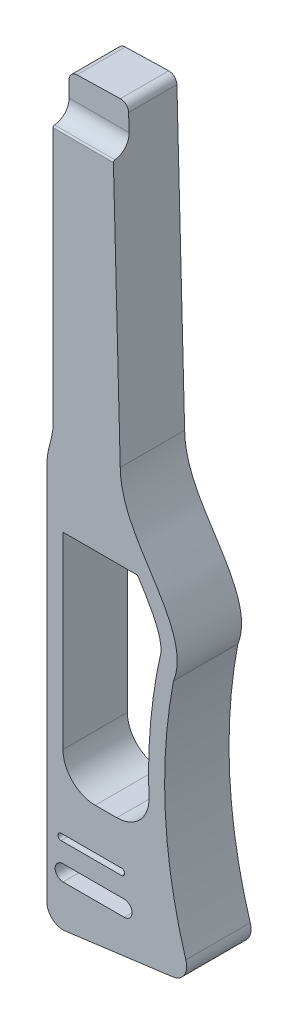
ISO-10303-21;
HEADER;
FILE_DESCRIPTION(('STEP AP214'),'2;1');
FILE_NAME('part.step','',(''),(''),'','','');
FILE_SCHEMA(('AUTOMOTIVE_DESIGN { 1 0 10303 214 1 1 1 1 }'));
ENDSEC;
DATA;
#1=APPLICATION_CONTEXT('core data for automotive mechanical design processes');
#2=APPLICATION_PROTOCOL_DEFINITION('international standard','automotive_design',2000,#1);
#3=PRODUCT_CONTEXT('',#1,'mechanical');
#4=PRODUCT('Part','Part','',(#3));
#5=PRODUCT_RELATED_PRODUCT_CATEGORY('part','',(#4));
#6=PRODUCT_DEFINITION_FORMATION('','',#4);
#7=PRODUCT_DEFINITION_CONTEXT('part definition',#1,'design');
#8=PRODUCT_DEFINITION('design','',#6,#7);
#9=PRODUCT_DEFINITION_SHAPE('','',#8);
#10=(LENGTH_UNIT() NAMED_UNIT(*) SI_UNIT(.MILLI.,.METRE.));
#11=(NAMED_UNIT(*) PLANE_ANGLE_UNIT() SI_UNIT($,.RADIAN.));
#12=(NAMED_UNIT(*) SI_UNIT($,.STERADIAN.) SOLID_ANGLE_UNIT());
#13=UNCERTAINTY_MEASURE_WITH_UNIT(LENGTH_MEASURE(1.E-05),#10,'distance_accuracy_value','');
#14=(GEOMETRIC_REPRESENTATION_CONTEXT(3) GLOBAL_UNCERTAINTY_ASSIGNED_CONTEXT((#13)) GLOBAL_UNIT_ASSIGNED_CONTEXT((#10,
#11,#12)) REPRESENTATION_CONTEXT('',''));
#15=CARTESIAN_POINT('',(0.,0.,0.));
#16=DIRECTION('',(0.,0.,1.));
#17=DIRECTION('',(1.,0.,0.));
#18=AXIS2_PLACEMENT_3D('',#15,#16,#17);
#19=CARTESIAN_POINT('',(0.,0.,40.));
#20=DIRECTION('',(0.,0.,1.));
#21=DIRECTION('',(1.,0.,0.));
#22=AXIS2_PLACEMENT_3D('',#19,#20,#21);
#23=PLANE('',#22);
#24=DIRECTION('',(0.02611191414376,-0.999659025838185,0.));
#25=VECTOR('',#24,1.);
#26=CARTESIAN_POINT('',(305.905264689105,7.99049656055332,40.));
#27=LINE('',#26,#25);
#28=CARTESIAN_POINT('',(292.8468141482,507.915468541098,40.));
#29=VERTEX_POINT('',#28);
#30=CARTESIAN_POINT('',(297.075455465632,346.027702032291,40.));
#31=VERTEX_POINT('',#30);
#32=EDGE_CURVE('E357',#29,#31,#27,.T.);
#33=ORIENTED_EDGE('',*,*,#32,.F.);
#34=DIRECTION('',(-1.,0.,0.));
#35=VECTOR('',#34,1.);
#36=CARTESIAN_POINT('',(260.321883100871,507.915468541098,40.));
#37=LINE('',#36,#35);
#38=CARTESIAN_POINT('',(255.321883100871,507.915468541098,40.));
#39=VERTEX_POINT('',#38);
#40=EDGE_CURVE('E449',#29,#39,#37,.T.);
#41=ORIENTED_EDGE('',*,*,#40,.T.);
#42=DIRECTION('',(0.,1.,0.));
#43=VECTOR('',#42,1.);
#44=CARTESIAN_POINT('',(255.321883100871,0.,40.));
#45=LINE('',#44,#43);
#46=CARTESIAN_POINT('',(255.321883100871,346.027702032291,40.));
#47=VERTEX_POINT('',#46);
#48=EDGE_CURVE('E410',#47,#39,#45,.T.);
#49=ORIENTED_EDGE('',*,*,#48,.F.);
#50=CARTESIAN_POINT('',(255.321883100871,346.027702032291,40.));
#51=CARTESIAN_POINT('',(254.757957001692,342.410351737177,40.));
#52=CARTESIAN_POINT('',(253.986764209967,338.857518857142,40.));
#53=CARTESIAN_POINT('',(253.008304725104,335.369203390077,40.));
#54=B_SPLINE_CURVE_WITH_KNOTS('',3,(#50,#51,#52,#53),.UNSPECIFIED.,.F.,.F.,(4,4),(0.,
0.135221531156),.UNSPECIFIED.);
#55=CARTESIAN_POINT('',(253.008304725104,335.369203390077,40.));
#56=VERTEX_POINT('',#55);
#57=EDGE_CURVE('E489',#47,#56,#54,.T.);
#58=ORIENTED_EDGE('',*,*,#57,.T.);
#59=CARTESIAN_POINT('',(291.521898802891,324.566283821207,40.));
#60=DIRECTION('',(0.,0.,1.));
#61=DIRECTION('',(1.,0.,0.));
#62=AXIS2_PLACEMENT_3D('',#59,#60,#61);
#63=CIRCLE('',#62,39.9999999999999);
#64=CARTESIAN_POINT('',(251.521898802891,324.566283821207,40.));
#65=VERTEX_POINT('',#64);
#66=EDGE_CURVE('E494',#65,#56,#63,.F.);
#67=ORIENTED_EDGE('',*,*,#66,.F.);
#68=DIRECTION('',(0.,-1.,0.));
#69=VECTOR('',#68,1.);
#70=CARTESIAN_POINT('',(251.521898802891,0.,40.));
#71=LINE('',#70,#69);
#72=CARTESIAN_POINT('',(251.521898802891,89.4346566660772,40.));
#73=VERTEX_POINT('',#72);
#74=EDGE_CURVE('E527',#65,#73,#71,.T.);
#75=ORIENTED_EDGE('',*,*,#74,.T.);
#76=CARTESIAN_POINT('',(261.521898802891,89.4346566660772,40.));
#77=DIRECTION('',(0.,0.,1.));
#78=DIRECTION('',(1.,0.,0.));
#79=AXIS2_PLACEMENT_3D('',#76,#77,#78);
#80=CIRCLE('',#79,10.);
#81=CARTESIAN_POINT('',(262.816280155599,79.5187816712135,40.));
#82=VERTEX_POINT('',#81);
#83=EDGE_CURVE('E528',#73,#82,#80,.T.);
#84=ORIENTED_EDGE('',*,*,#83,.T.);
#85=DIRECTION('',(0.991587499486364,0.129438135270795,0.));
#86=VECTOR('',#85,1.);
#87=CARTESIAN_POINT('',(-5.80289031391074,44.4542366446055,40.));
#88=LINE('',#87,#86);
#89=CARTESIAN_POINT('',(329.661316311539,88.2444834742471,40.));
#90=VERTEX_POINT('',#89);
#91=EDGE_CURVE('E530',#82,#90,#88,.T.);
#92=ORIENTED_EDGE('',*,*,#91,.T.);
#93=CARTESIAN_POINT('',(328.366934958831,98.1603584691108,40.));
#94=DIRECTION('',(0.,0.,1.));
#95=DIRECTION('',(1.,0.,0.));
#96=AXIS2_PLACEMENT_3D('',#93,#94,#95);
#97=CIRCLE('',#96,9.99999999999999);
#98=CARTESIAN_POINT('',(337.812674038105,101.44334693182,40.));
#99=VERTEX_POINT('',#98);
#100=EDGE_CURVE('E533',#90,#99,#97,.T.);
#101=ORIENTED_EDGE('',*,*,#100,.T.);
#102=CARTESIAN_POINT('',(628.997561791696,189.985352761071,40.));
#103=DIRECTION('',(0.,0.,1.));
#104=DIRECTION('',(1.,0.,0.));
#105=AXIS2_PLACEMENT_3D('',#102,#103,#104);
#106=CIRCLE('',#105,304.349019469981);
#107=CARTESIAN_POINT('',(330.156614349446,247.625736036663,40.));
#108=VERTEX_POINT('',#107);
#109=EDGE_CURVE('E358',#99,#108,#106,.F.);
#110=ORIENTED_EDGE('',*,*,#109,.T.);
#111=CARTESIAN_POINT('',(330.156614349446,247.625736036663,40.));
#112=CARTESIAN_POINT('',(336.006706917037,262.277420590883,40.));
#113=CARTESIAN_POINT('',(320.767736692271,296.804281945168,40.));
#114=CARTESIAN_POINT('',(297.413910682926,323.509414189747,40.));
#115=CARTESIAN_POINT('',(297.075455465632,346.027702032291,40.));
#116=B_SPLINE_CURVE_WITH_KNOTS('',3,(#111,#112,#113,#114,#115),.UNSPECIFIED.,.F.,.F.,(4,1,4),
(0.,0.411549100764503,1.),.UNSPECIFIED.);
#117=EDGE_CURVE('E350',#108,#31,#116,.T.);
#118=ORIENTED_EDGE('',*,*,#117,.T.);
#119=EDGE_LOOP('',(#33,#41,#49,#58,#67,#75,#84,#92,#101,#110,#118));
#120=FACE_BOUND('',#119,.T.);
#121=CARTESIAN_POINT('',(260.321883100871,128.869919691201,40.));
#122=DIRECTION('',(0.,0.,1.));
#123=DIRECTION('',(-1.,0.,0.));
#124=AXIS2_PLACEMENT_3D('',#121,#122,#123);
#125=CIRCLE('',#124,2.);
#126=CARTESIAN_POINT('',(260.321883100871,130.869919691201,40.));
#127=VERTEX_POINT('',#126);
#128=CARTESIAN_POINT('',(260.321883100871,126.869919691201,40.));
#129=VERTEX_POINT('',#128);
#130=EDGE_CURVE('E577',#127,#129,#125,.T.);
#131=ORIENTED_EDGE('',*,*,#130,.F.);
#132=DIRECTION('',(-1.,0.,0.));
#133=VECTOR('',#132,1.);
#134=CARTESIAN_POINT('',(260.321883100871,130.869919691201,40.));
#135=LINE('',#134,#133);
#136=CARTESIAN_POINT('',(297.821883100871,130.869919691201,40.));
#137=VERTEX_POINT('',#136);
#138=EDGE_CURVE('E567',#137,#127,#135,.T.);
#139=ORIENTED_EDGE('',*,*,#138,.F.);
#140=CARTESIAN_POINT('',(297.821883100871,128.869919691201,40.));
#141=DIRECTION('',(0.,0.,1.));
#142=DIRECTION('',(1.,0.,0.));
#143=AXIS2_PLACEMENT_3D('',#140,#141,#142);
#144=CIRCLE('',#143,2.);
#145=CARTESIAN_POINT('',(297.821883100871,126.869919691201,40.));
#146=VERTEX_POINT('',#145);
#147=EDGE_CURVE('E571',#146,#137,#144,.T.);
#148=ORIENTED_EDGE('',*,*,#147,.F.);
#149=DIRECTION('',(1.,0.,0.));
#150=VECTOR('',#149,1.);
#151=CARTESIAN_POINT('',(260.321883100871,126.869919691201,40.));
#152=LINE('',#151,#150);
#153=EDGE_CURVE('E574',#129,#146,#152,.T.);
#154=ORIENTED_EDGE('',*,*,#153,.F.);
#155=EDGE_LOOP('',(#131,#139,#148,#154));
#156=FACE_BOUND('',#155,.T.);
#157=CARTESIAN_POINT('',(299.520758284586,110.129911588462,40.));
#158=DIRECTION('',(0.,0.,1.));
#159=DIRECTION('',(1.,0.,0.));
#160=AXIS2_PLACEMENT_3D('',#157,#158,#159);
#161=CIRCLE('',#160,4.89448851457758);
#162=CARTESIAN_POINT('',(299.520758284586,105.235423073884,40.));
#163=VERTEX_POINT('',#162);
#164=CARTESIAN_POINT('',(299.520758284586,115.024400103039,40.));
#165=VERTEX_POINT('',#164);
#166=EDGE_CURVE('E616',#163,#165,#161,.T.);
#167=ORIENTED_EDGE('',*,*,#166,.F.);
#168=DIRECTION('',(1.,0.,0.));
#169=VECTOR('',#168,1.);
#170=CARTESIAN_POINT('',(0.,105.235423073884,40.));
#171=LINE('',#170,#169);
#172=CARTESIAN_POINT('',(261.521898802891,105.235423073884,40.));
#173=VERTEX_POINT('',#172);
#174=EDGE_CURVE('E603',#173,#163,#171,.T.);
#175=ORIENTED_EDGE('',*,*,#174,.F.);
#176=CARTESIAN_POINT('',(261.521898802891,110.129911588462,40.));
#177=DIRECTION('',(0.,0.,1.));
#178=DIRECTION('',(1.,0.,0.));
#179=AXIS2_PLACEMENT_3D('',#176,#177,#178);
#180=CIRCLE('',#179,4.89448851457758);
#181=CARTESIAN_POINT('',(261.521898802891,115.024400103039,40.));
#182=VERTEX_POINT('',#181);
#183=EDGE_CURVE('E599',#182,#173,#180,.T.);
#184=ORIENTED_EDGE('',*,*,#183,.F.);
#185=DIRECTION('',(1.,0.,0.));
#186=VECTOR('',#185,1.);
#187=CARTESIAN_POINT('',(0.,115.024400103039,40.));
#188=LINE('',#187,#186);
#189=EDGE_CURVE('E613',#182,#165,#188,.T.);
#190=ORIENTED_EDGE('',*,*,#189,.T.);
#191=EDGE_LOOP('',(#167,#175,#184,#190));
#192=FACE_BOUND('',#191,.T.);
#193=CARTESIAN_POINT('',(628.997561791696,189.985352761071,40.));
#194=DIRECTION('',(0.,0.,1.));
#195=DIRECTION('',(1.,0.,0.));
#196=AXIS2_PLACEMENT_3D('',#193,#194,#195);
#197=CIRCLE('',#196,314.349019469981);
#198=CARTESIAN_POINT('',(322.456329799641,259.611347407694,40.));
#199=VERTEX_POINT('',#198);
#200=CARTESIAN_POINT('',(314.904588230465,177.300322165835,40.));
#201=VERTEX_POINT('',#200);
#202=EDGE_CURVE('E249',#199,#201,#197,.T.);
#203=ORIENTED_EDGE('',*,*,#202,.T.);
#204=CARTESIAN_POINT('',(294.920878779688,176.493255510012,40.));
#205=DIRECTION('',(0.,0.,1.));
#206=DIRECTION('',(1.,0.,0.));
#207=AXIS2_PLACEMENT_3D('',#204,#205,#206);
#208=CIRCLE('',#207,20.);
#209=CARTESIAN_POINT('',(294.920878779688,156.493255510012,40.));
#210=VERTEX_POINT('',#209);
#211=EDGE_CURVE('E628',#210,#201,#208,.T.);
#212=ORIENTED_EDGE('',*,*,#211,.F.);
#213=DIRECTION('',(1.,0.,0.));
#214=VECTOR('',#213,1.);
#215=CARTESIAN_POINT('',(0.,156.493255510012,40.));
#216=LINE('',#215,#214);
#217=CARTESIAN_POINT('',(281.521898802891,156.493255510012,40.));
#218=VERTEX_POINT('',#217);
#219=EDGE_CURVE('E651',#218,#210,#216,.T.);
#220=ORIENTED_EDGE('',*,*,#219,.F.);
#221=CARTESIAN_POINT('',(281.521898802891,176.493255510012,40.));
#222=DIRECTION('',(0.,0.,1.));
#223=DIRECTION('',(1.,0.,0.));
#224=AXIS2_PLACEMENT_3D('',#221,#222,#223);
#225=CIRCLE('',#224,20.);
#226=CARTESIAN_POINT('',(261.521898802891,176.493255510012,40.));
#227=VERTEX_POINT('',#226);
#228=EDGE_CURVE('E653',#227,#218,#225,.T.);
#229=ORIENTED_EDGE('',*,*,#228,.F.);
#230=DIRECTION('',(0.,-1.,0.));
#231=VECTOR('',#230,1.);
#232=CARTESIAN_POINT('',(261.521898802891,0.,40.));
#233=LINE('',#232,#231);
#234=CARTESIAN_POINT('',(261.521898802891,293.411121555791,40.));
#235=VERTEX_POINT('',#234);
#236=EDGE_CURVE('E261',#235,#227,#233,.T.);
#237=ORIENTED_EDGE('',*,*,#236,.F.);
#238=DIRECTION('',(1.,0.,0.));
#239=VECTOR('',#238,1.);
#240=CARTESIAN_POINT('',(0.,293.411121555791,40.));
#241=LINE('',#240,#239);
#242=CARTESIAN_POINT('',(307.783918876478,293.411121555791,40.));
#243=VERTEX_POINT('',#242);
#244=EDGE_CURVE('E259',#235,#243,#241,.T.);
#245=ORIENTED_EDGE('',*,*,#244,.T.);
#246=CARTESIAN_POINT('',(320.869536480314,251.333860178689,40.));
#247=CARTESIAN_POINT('',(321.022811460016,251.717740711638,40.));
#248=CARTESIAN_POINT('',(321.312265039442,252.503219479171,40.));
#249=CARTESIAN_POINT('',(321.781324699732,254.027117433816,40.));
#250=CARTESIAN_POINT('',(322.198052594103,255.912665140804,40.));
#251=CARTESIAN_POINT('',(322.451286003811,258.167291475826,40.));
#252=CARTESIAN_POINT('',(322.485456194761,261.21681108655,40.));
#253=CARTESIAN_POINT('',(321.977489561721,265.178835065815,40.));
#254=CARTESIAN_POINT('',(320.516125801257,270.243060554965,40.));
#255=CARTESIAN_POINT('',(318.282615137732,275.554318374428,40.));
#256=CARTESIAN_POINT('',(315.425430629096,281.021812848812,40.));
#257=CARTESIAN_POINT('',(312.162343995067,286.528772314385,40.));
#258=CARTESIAN_POINT('',(309.263103761047,291.113556213928,40.));
#259=CARTESIAN_POINT('',(305.650731956235,296.726297616861,40.));
#260=CARTESIAN_POINT('',(300.700499628361,304.406752318553,40.));
#261=CARTESIAN_POINT('',(295.404146990645,313.661552152343,40.));
#262=CARTESIAN_POINT('',(291.507151791765,322.655127580493,40.));
#263=CARTESIAN_POINT('',(289.156277231767,329.866406069241,40.));
#264=CARTESIAN_POINT('',(287.827149997347,336.303449441939,40.));
#265=CARTESIAN_POINT('',(287.229410838016,341.683767052594,40.));
#266=CARTESIAN_POINT('',(287.097473278347,344.487653916296,40.));
#267=CARTESIAN_POINT('',(287.076584814505,345.877416630373,40.));
#268=B_SPLINE_CURVE_WITH_KNOTS('',3,(#246,#247,#248,#249,#250,#251,#252,#253,#254,#255,#256,
#257,#258,#259,#260,#261,#262,#263,#264,#265,#266,#267),.UNSPECIFIED.,.F.,.F.,(4,1,1,1,1,1,1,1,
1,1,1,1,1,1,1,1,1,1,1,4),(0.,0.015625,0.03125,0.0625,0.09375,0.125,0.1875,0.25,0.3125,0.375,
0.4375,0.498593555081096,0.529843555081096,0.625,0.75,0.8125,0.875,0.9375,0.96875,1.),.UNSPECIFIED.);
#269=EDGE_CURVE('E241',#199,#243,#268,.T.);
#270=ORIENTED_EDGE('',*,*,#269,.F.);
#271=EDGE_LOOP('',(#203,#212,#220,#229,#237,#245,#270));
#272=FACE_BOUND('',#271,.T.);
#273=ADVANCED_FACE('F35',(#120,#156,#192,#272),#23,.T.);
#274=CARTESIAN_POINT('',(0.,0.,0.));
#275=DIRECTION('',(0.,0.,1.));
#276=DIRECTION('',(1.,0.,0.));
#277=AXIS2_PLACEMENT_3D('',#274,#275,#276);
#278=PLANE('',#277);
#279=DIRECTION('',(1.,0.,0.));
#280=VECTOR('',#279,1.);
#281=CARTESIAN_POINT('',(0.,105.235423073884,0.));
#282=LINE('',#281,#280);
#283=CARTESIAN_POINT('',(261.521898802891,105.235423073884,0.));
#284=VERTEX_POINT('',#283);
#285=CARTESIAN_POINT('',(299.520758284586,105.235423073884,0.));
#286=VERTEX_POINT('',#285);
#287=EDGE_CURVE('E245',#284,#286,#282,.T.);
#288=ORIENTED_EDGE('',*,*,#287,.T.);
#289=CARTESIAN_POINT('',(299.520758284586,110.129911588462,0.));
#290=DIRECTION('',(0.,0.,1.));
#291=DIRECTION('',(1.,0.,0.));
#292=AXIS2_PLACEMENT_3D('',#289,#290,#291);
#293=CIRCLE('',#292,4.89448851457758);
#294=CARTESIAN_POINT('',(299.520758284586,115.024400103039,0.));
#295=VERTEX_POINT('',#294);
#296=EDGE_CURVE('E607',#286,#295,#293,.T.);
#297=ORIENTED_EDGE('',*,*,#296,.T.);
#298=DIRECTION('',(1.,0.,0.));
#299=VECTOR('',#298,1.);
#300=CARTESIAN_POINT('',(0.,115.024400103039,0.));
#301=LINE('',#300,#299);
#302=CARTESIAN_POINT('',(261.521898802891,115.024400103039,0.));
#303=VERTEX_POINT('',#302);
#304=EDGE_CURVE('E604',#303,#295,#301,.T.);
#305=ORIENTED_EDGE('',*,*,#304,.F.);
#306=CARTESIAN_POINT('',(261.521898802891,110.129911588462,0.));
#307=DIRECTION('',(0.,0.,1.));
#308=DIRECTION('',(1.,0.,0.));
#309=AXIS2_PLACEMENT_3D('',#306,#307,#308);
#310=CIRCLE('',#309,4.89448851457758);
#311=EDGE_CURVE('E600',#303,#284,#310,.T.);
#312=ORIENTED_EDGE('',*,*,#311,.T.);
#313=EDGE_LOOP('',(#288,#297,#305,#312));
#314=FACE_BOUND('',#313,.T.);
#315=DIRECTION('',(0.,1.,0.));
#316=VECTOR('',#315,1.);
#317=CARTESIAN_POINT('',(255.321883100871,0.,0.));
#318=LINE('',#317,#316);
#319=CARTESIAN_POINT('',(255.321883100871,346.027702032291,0.));
#320=VERTEX_POINT('',#319);
#321=CARTESIAN_POINT('',(255.321883100871,528.780555709238,0.));
#322=VERTEX_POINT('',#321);
#323=EDGE_CURVE('E365',#320,#322,#318,.T.);
#324=ORIENTED_EDGE('',*,*,#323,.T.);
#325=CARTESIAN_POINT('',(260.321883100871,528.780555709238,0.));
#326=DIRECTION('',(0.,0.,1.));
#327=DIRECTION('',(1.,0.,0.));
#328=AXIS2_PLACEMENT_3D('',#325,#326,#327);
#329=CIRCLE('',#328,4.99999999999998);
#330=CARTESIAN_POINT('',(260.19721277039,533.779001198457,0.));
#331=VERTEX_POINT('',#330);
#332=EDGE_CURVE('E407',#331,#322,#329,.T.);
#333=ORIENTED_EDGE('',*,*,#332,.F.);
#334=DIRECTION('',(0.999689097843879,0.0249340660962317,0.));
#335=VECTOR('',#334,1.);
#336=CARTESIAN_POINT('',(-13.1433764143035,526.961389270695,0.));
#337=LINE('',#336,#335);
#338=CARTESIAN_POINT('',(287.157860281223,534.451448830908,0.));
#339=VERTEX_POINT('',#338);
#340=EDGE_CURVE('E404',#331,#339,#337,.T.);
#341=ORIENTED_EDGE('',*,*,#340,.T.);
#342=CARTESIAN_POINT('',(287.282530611704,529.453003341689,0.));
#343=DIRECTION('',(0.,0.,1.));
#344=DIRECTION('',(1.,0.,0.));
#345=AXIS2_PLACEMENT_3D('',#342,#343,#344);
#346=CIRCLE('',#345,4.99999999999995);
#347=CARTESIAN_POINT('',(292.280825740895,529.583562912408,0.));
#348=VERTEX_POINT('',#347);
#349=EDGE_CURVE('E401',#339,#348,#346,.F.);
#350=ORIENTED_EDGE('',*,*,#349,.T.);
#351=DIRECTION('',(0.02611191414376,-0.999659025838185,0.));
#352=VECTOR('',#351,1.);
#353=CARTESIAN_POINT('',(305.905264689105,7.99049656055332,0.));
#354=LINE('',#353,#352);
#355=CARTESIAN_POINT('',(297.075455465632,346.027702032291,0.));
#356=VERTEX_POINT('',#355);
#357=EDGE_CURVE('E395',#348,#356,#354,.T.);
#358=ORIENTED_EDGE('',*,*,#357,.T.);
#359=CARTESIAN_POINT('',(330.156614349446,247.625736036663,0.));
#360=CARTESIAN_POINT('',(336.006706917037,262.277420590883,0.));
#361=CARTESIAN_POINT('',(320.767736692271,296.804281945168,0.));
#362=CARTESIAN_POINT('',(297.413910682926,323.509414189747,0.));
#363=CARTESIAN_POINT('',(297.075455465632,346.027702032291,0.));
#364=B_SPLINE_CURVE_WITH_KNOTS('',3,(#359,#360,#361,#362,#363),.UNSPECIFIED.,.F.,.F.,(4,1,4),
(0.,0.411549100764503,1.),.UNSPECIFIED.);
#365=CARTESIAN_POINT('',(330.156614349446,247.625736036663,0.));
#366=VERTEX_POINT('',#365);
#367=EDGE_CURVE('E390',#366,#356,#364,.T.);
#368=ORIENTED_EDGE('',*,*,#367,.F.);
#369=CARTESIAN_POINT('',(628.997561791696,189.985352761071,0.));
#370=DIRECTION('',(0.,0.,1.));
#371=DIRECTION('',(1.,0.,0.));
#372=AXIS2_PLACEMENT_3D('',#369,#370,#371);
#373=CIRCLE('',#372,304.349019469981);
#374=CARTESIAN_POINT('',(337.812674038105,101.44334693182,0.));
#375=VERTEX_POINT('',#374);
#376=EDGE_CURVE('E388',#375,#366,#373,.F.);
#377=ORIENTED_EDGE('',*,*,#376,.F.);
#378=CARTESIAN_POINT('',(328.366934958831,98.1603584691108,0.));
#379=DIRECTION('',(0.,0.,1.));
#380=DIRECTION('',(1.,0.,0.));
#381=AXIS2_PLACEMENT_3D('',#378,#379,#380);
#382=CIRCLE('',#381,9.99999999999999);
#383=CARTESIAN_POINT('',(329.661316311539,88.2444834742471,0.));
#384=VERTEX_POINT('',#383);
#385=EDGE_CURVE('E386',#384,#375,#382,.T.);
#386=ORIENTED_EDGE('',*,*,#385,.F.);
#387=DIRECTION('',(0.991587499486364,0.129438135270795,0.));
#388=VECTOR('',#387,1.);
#389=CARTESIAN_POINT('',(-5.80289031391074,44.4542366446055,0.));
#390=LINE('',#389,#388);
#391=CARTESIAN_POINT('',(262.816280155599,79.5187816712135,0.));
#392=VERTEX_POINT('',#391);
#393=EDGE_CURVE('E384',#392,#384,#390,.T.);
#394=ORIENTED_EDGE('',*,*,#393,.F.);
#395=CARTESIAN_POINT('',(261.521898802891,89.4346566660772,0.));
#396=DIRECTION('',(0.,0.,1.));
#397=DIRECTION('',(1.,0.,0.));
#398=AXIS2_PLACEMENT_3D('',#395,#396,#397);
#399=CIRCLE('',#398,10.);
#400=CARTESIAN_POINT('',(251.521898802891,89.4346566660772,0.));
#401=VERTEX_POINT('',#400);
#402=EDGE_CURVE('E382',#401,#392,#399,.T.);
#403=ORIENTED_EDGE('',*,*,#402,.F.);
#404=DIRECTION('',(0.,-1.,0.));
#405=VECTOR('',#404,1.);
#406=CARTESIAN_POINT('',(251.521898802891,0.,0.));
#407=LINE('',#406,#405);
#408=CARTESIAN_POINT('',(251.521898802891,324.566283821207,0.));
#409=VERTEX_POINT('',#408);
#410=EDGE_CURVE('E380',#409,#401,#407,.T.);
#411=ORIENTED_EDGE('',*,*,#410,.F.);
#412=CARTESIAN_POINT('',(291.521898802891,324.566283821207,0.));
#413=DIRECTION('',(0.,0.,1.));
#414=DIRECTION('',(1.,0.,0.));
#415=AXIS2_PLACEMENT_3D('',#412,#413,#414);
#416=CIRCLE('',#415,39.9999999999999);
#417=CARTESIAN_POINT('',(253.008304725104,335.369203390077,0.));
#418=VERTEX_POINT('',#417);
#419=EDGE_CURVE('E374',#409,#418,#416,.F.);
#420=ORIENTED_EDGE('',*,*,#419,.T.);
#421=CARTESIAN_POINT('',(255.321883100871,346.027702032291,0.));
#422=CARTESIAN_POINT('',(254.757957001692,342.410351737177,0.));
#423=CARTESIAN_POINT('',(253.986764209967,338.857518857142,0.));
#424=CARTESIAN_POINT('',(253.008304725104,335.369203390077,0.));
#425=B_SPLINE_CURVE_WITH_KNOTS('',3,(#421,#422,#423,#424),.UNSPECIFIED.,.F.,.F.,(4,4),(0.,
0.135221531156),.UNSPECIFIED.);
#426=EDGE_CURVE('E368',#320,#418,#425,.T.);
#427=ORIENTED_EDGE('',*,*,#426,.F.);
#428=EDGE_LOOP('',(#324,#333,#341,#350,#358,#368,#377,#386,#394,#403,#411,#420,#427));
#429=FACE_BOUND('',#428,.T.);
#430=CARTESIAN_POINT('',(294.920878779688,176.493255510012,0.));
#431=DIRECTION('',(0.,0.,1.));
#432=DIRECTION('',(1.,0.,0.));
#433=AXIS2_PLACEMENT_3D('',#430,#431,#432);
#434=CIRCLE('',#433,20.);
#435=CARTESIAN_POINT('',(294.920878779688,156.493255510012,0.));
#436=VERTEX_POINT('',#435);
#437=CARTESIAN_POINT('',(314.904588230465,177.300322165835,0.));
#438=VERTEX_POINT('',#437);
#439=EDGE_CURVE('E254',#436,#438,#434,.T.);
#440=ORIENTED_EDGE('',*,*,#439,.T.);
#441=CARTESIAN_POINT('',(628.997561791696,189.985352761071,0.));
#442=DIRECTION('',(0.,0.,1.));
#443=DIRECTION('',(1.,0.,0.));
#444=AXIS2_PLACEMENT_3D('',#441,#442,#443);
#445=CIRCLE('',#444,314.349019469981);
#446=CARTESIAN_POINT('',(322.456329799641,259.611347407694,0.));
#447=VERTEX_POINT('',#446);
#448=EDGE_CURVE('E58',#447,#438,#445,.T.);
#449=ORIENTED_EDGE('',*,*,#448,.F.);
#450=CARTESIAN_POINT('',(320.869536480314,251.333860178689,0.));
#451=CARTESIAN_POINT('',(321.022811460016,251.717740711638,0.));
#452=CARTESIAN_POINT('',(321.312265039442,252.503219479171,0.));
#453=CARTESIAN_POINT('',(321.781324699732,254.027117433816,0.));
#454=CARTESIAN_POINT('',(322.198052594103,255.912665140804,0.));
#455=CARTESIAN_POINT('',(322.451286003811,258.167291475826,0.));
#456=CARTESIAN_POINT('',(322.485456194761,261.21681108655,0.));
#457=CARTESIAN_POINT('',(321.977489561721,265.178835065815,0.));
#458=CARTESIAN_POINT('',(320.516125801257,270.243060554965,0.));
#459=CARTESIAN_POINT('',(318.282615137732,275.554318374428,0.));
#460=CARTESIAN_POINT('',(315.425430629096,281.021812848812,0.));
#461=CARTESIAN_POINT('',(312.162343995067,286.528772314385,0.));
#462=CARTESIAN_POINT('',(309.263103761047,291.113556213928,0.));
#463=CARTESIAN_POINT('',(305.650731956235,296.726297616861,0.));
#464=CARTESIAN_POINT('',(300.700499628361,304.406752318553,0.));
#465=CARTESIAN_POINT('',(295.404146990645,313.661552152343,0.));
#466=CARTESIAN_POINT('',(291.507151791765,322.655127580493,0.));
#467=CARTESIAN_POINT('',(289.156277231767,329.866406069241,0.));
#468=CARTESIAN_POINT('',(287.827149997347,336.303449441939,0.));
#469=CARTESIAN_POINT('',(287.229410838016,341.683767052594,0.));
#470=CARTESIAN_POINT('',(287.097473278347,344.487653916296,0.));
#471=CARTESIAN_POINT('',(287.076584814505,345.877416630373,0.));
#472=B_SPLINE_CURVE_WITH_KNOTS('',3,(#450,#451,#452,#453,#454,#455,#456,#457,#458,#459,#460,
#461,#462,#463,#464,#465,#466,#467,#468,#469,#470,#471),.UNSPECIFIED.,.F.,.F.,(4,1,1,1,1,1,1,1,
1,1,1,1,1,1,1,1,1,1,1,4),(0.,0.015625,0.03125,0.0625,0.09375,0.125,0.1875,0.25,0.3125,0.375,
0.4375,0.498593555081096,0.529843555081096,0.625,0.75,0.8125,0.875,0.9375,0.96875,1.),.UNSPECIFIED.);
#473=CARTESIAN_POINT('',(307.783918876478,293.411121555791,0.));
#474=VERTEX_POINT('',#473);
#475=EDGE_CURVE('E244',#447,#474,#472,.T.);
#476=ORIENTED_EDGE('',*,*,#475,.T.);
#477=DIRECTION('',(1.,0.,0.));
#478=VECTOR('',#477,1.);
#479=CARTESIAN_POINT('',(0.,293.411121555791,0.));
#480=LINE('',#479,#478);
#481=CARTESIAN_POINT('',(261.521898802891,293.411121555791,0.));
#482=VERTEX_POINT('',#481);
#483=EDGE_CURVE('E640',#482,#474,#480,.T.);
#484=ORIENTED_EDGE('',*,*,#483,.F.);
#485=DIRECTION('',(0.,-1.,0.));
#486=VECTOR('',#485,1.);
#487=CARTESIAN_POINT('',(261.521898802891,0.,0.));
#488=LINE('',#487,#486);
#489=CARTESIAN_POINT('',(261.521898802891,176.493255510012,0.));
#490=VERTEX_POINT('',#489);
#491=EDGE_CURVE('E637',#482,#490,#488,.T.);
#492=ORIENTED_EDGE('',*,*,#491,.T.);
#493=CARTESIAN_POINT('',(281.521898802891,176.493255510012,0.));
#494=DIRECTION('',(0.,0.,1.));
#495=DIRECTION('',(1.,0.,0.));
#496=AXIS2_PLACEMENT_3D('',#493,#494,#495);
#497=CIRCLE('',#496,20.);
#498=CARTESIAN_POINT('',(281.521898802891,156.493255510012,0.));
#499=VERTEX_POINT('',#498);
#500=EDGE_CURVE('E634',#490,#499,#497,.T.);
#501=ORIENTED_EDGE('',*,*,#500,.T.);
#502=DIRECTION('',(1.,0.,0.));
#503=VECTOR('',#502,1.);
#504=CARTESIAN_POINT('',(0.,156.493255510012,0.));
#505=LINE('',#504,#503);
#506=EDGE_CURVE('E631',#499,#436,#505,.T.);
#507=ORIENTED_EDGE('',*,*,#506,.T.);
#508=EDGE_LOOP('',(#440,#449,#476,#484,#492,#501,#507));
#509=FACE_BOUND('',#508,.T.);
#510=ADVANCED_FACE('F321',(#314,#429,#509),#278,.F.);
#511=CARTESIAN_POINT('',(260.321883100871,507.915468541098,39.));
#512=DIRECTION('',(1.,0.,0.));
#513=DIRECTION('',(0.,0.,-1.));
#514=AXIS2_PLACEMENT_3D('',#511,#512,#513);
#515=CYLINDRICAL_SURFACE('',#514,1.);
#516=ORIENTED_EDGE('',*,*,#40,.F.);
#517=CARTESIAN_POINT('',(292.8468141482,507.915468541098,39.));
#518=DIRECTION('',(0.999659025838185,0.02611191414376,0.));
#519=DIRECTION('',(0.02611191414376,-0.999659025838185,0.));
#520=AXIS2_PLACEMENT_3D('',#517,#518,#519);
#521=ELLIPSE('',#520,1.00034109046485,1.);
#522=CARTESIAN_POINT('',(292.820801488744,508.911327736562,39.0909090909091));
#523=VERTEX_POINT('',#522);
#524=EDGE_CURVE('E43',#523,#29,#521,.T.);
#525=ORIENTED_EDGE('',*,*,#524,.F.);
#526=DIRECTION('',(1.,0.,0.));
#527=VECTOR('',#526,1.);
#528=CARTESIAN_POINT('',(260.321883100871,508.911327736562,39.0909090909091));
#529=LINE('',#528,#527);
#530=CARTESIAN_POINT('',(255.321883100871,508.911327736562,39.0909090909091));
#531=VERTEX_POINT('',#530);
#532=EDGE_CURVE('E452',#531,#523,#529,.T.);
#533=ORIENTED_EDGE('',*,*,#532,.F.);
#534=CARTESIAN_POINT('',(255.321883100871,507.915468541098,39.));
#535=DIRECTION('',(-1.,0.,0.));
#536=DIRECTION('',(0.,-1.,0.));
#537=AXIS2_PLACEMENT_3D('',#534,#535,#536);
#538=CIRCLE('',#537,1.);
#539=EDGE_CURVE('E11',#39,#531,#538,.T.);
#540=ORIENTED_EDGE('',*,*,#539,.F.);
#541=EDGE_LOOP('',(#516,#525,#533,#540));
#542=FACE_BOUND('',#541,.T.);
#543=ADVANCED_FACE('F37',(#542),#515,.T.);
#544=CARTESIAN_POINT('',(260.321883100871,518.869919691201,40.));
#545=DIRECTION('',(1.,0.,0.));
#546=DIRECTION('',(0.,0.,-1.));
#547=AXIS2_PLACEMENT_3D('',#544,#545,#546);
#548=CYLINDRICAL_SURFACE('',#547,10.);
#549=CARTESIAN_POINT('',(255.321883100871,518.869919691201,40.));
#550=DIRECTION('',(-1.,0.,0.));
#551=DIRECTION('',(0.,-1.,0.));
#552=AXIS2_PLACEMENT_3D('',#549,#550,#551);
#553=CIRCLE('',#552,10.);
#554=CARTESIAN_POINT('',(255.321883100871,518.869919691201,30.));
#555=VERTEX_POINT('',#554);
#556=EDGE_CURVE('E444',#555,#531,#553,.T.);
#557=ORIENTED_EDGE('',*,*,#556,.T.);
#558=ORIENTED_EDGE('',*,*,#532,.T.);
#559=CARTESIAN_POINT('',(292.560674894184,518.869919691201,40.));
#560=DIRECTION('',(0.999659025838185,0.02611191414376,0.));
#561=DIRECTION('',(0.02611191414376,-0.999659025838185,0.));
#562=AXIS2_PLACEMENT_3D('',#559,#560,#561);
#563=ELLIPSE('',#562,10.0034109046485,10.);
#564=CARTESIAN_POINT('',(292.560674894184,518.869919691201,30.));
#565=VERTEX_POINT('',#564);
#566=EDGE_CURVE('E447',#523,#565,#563,.T.);
#567=ORIENTED_EDGE('',*,*,#566,.T.);
#568=DIRECTION('',(1.,0.,0.));
#569=VECTOR('',#568,1.);
#570=CARTESIAN_POINT('',(260.321883100871,518.869919691201,30.));
#571=LINE('',#570,#569);
#572=EDGE_CURVE('E441',#555,#565,#571,.T.);
#573=ORIENTED_EDGE('',*,*,#572,.F.);
#574=EDGE_LOOP('',(#557,#558,#567,#573));
#575=FACE_BOUND('',#574,.T.);
#576=ADVANCED_FACE('F338',(#575),#548,.F.);
#577=CARTESIAN_POINT('',(287.282530611704,529.453003341689,40.));
#578=DIRECTION('',(0.,0.,-1.));
#579=DIRECTION('',(-1.,0.,0.));
#580=AXIS2_PLACEMENT_3D('',#577,#578,#579);
#581=CYLINDRICAL_SURFACE('',#580,4.99999999999995);
#582=DIRECTION('',(0.,0.,-1.));
#583=VECTOR('',#582,1.);
#584=CARTESIAN_POINT('',(287.157860281223,534.451448830908,40.));
#585=LINE('',#584,#583);
#586=CARTESIAN_POINT('',(287.157860281223,534.451448830908,30.));
#587=VERTEX_POINT('',#586);
#588=EDGE_CURVE('E414',#587,#339,#585,.T.);
#589=ORIENTED_EDGE('',*,*,#588,.F.);
#590=CARTESIAN_POINT('',(287.282530611704,529.453003341689,30.));
#591=DIRECTION('',(0.,0.,1.));
#592=DIRECTION('',(1.,0.,0.));
#593=AXIS2_PLACEMENT_3D('',#590,#591,#592);
#594=CIRCLE('',#593,4.99999999999995);
#595=CARTESIAN_POINT('',(292.280825740895,529.583562912408,30.));
#596=VERTEX_POINT('',#595);
#597=EDGE_CURVE('E477',#596,#587,#594,.T.);
#598=ORIENTED_EDGE('',*,*,#597,.F.);
#599=DIRECTION('',(0.,0.,-1.));
#600=VECTOR('',#599,1.);
#601=CARTESIAN_POINT('',(292.280825740895,529.583562912408,40.));
#602=LINE('',#601,#600);
#603=EDGE_CURVE('E416',#596,#348,#602,.T.);
#604=ORIENTED_EDGE('',*,*,#603,.T.);
#605=ORIENTED_EDGE('',*,*,#349,.F.);
#606=EDGE_LOOP('',(#589,#598,#604,#605));
#607=FACE_BOUND('',#606,.T.);
#608=ADVANCED_FACE('F334',(#607),#581,.T.);
#609=CARTESIAN_POINT('',(-13.1433764143035,526.961389270695,40.));
#610=DIRECTION('',(-0.0249340660962317,0.999689097843879,0.));
#611=DIRECTION('',(-0.999689097843879,-0.0249340660962317,0.));
#612=AXIS2_PLACEMENT_3D('',#609,#610,#611);
#613=PLANE('',#612);
#614=DIRECTION('',(0.,0.,-1.));
#615=VECTOR('',#614,1.);
#616=CARTESIAN_POINT('',(260.19721277039,533.779001198457,40.));
#617=LINE('',#616,#615);
#618=CARTESIAN_POINT('',(260.19721277039,533.779001198457,30.));
#619=VERTEX_POINT('',#618);
#620=EDGE_CURVE('E412',#619,#331,#617,.T.);
#621=ORIENTED_EDGE('',*,*,#620,.F.);
#622=DIRECTION('',(-0.999689097843879,-0.0249340660962317,0.));
#623=VECTOR('',#622,1.);
#624=CARTESIAN_POINT('',(260.19721277039,533.779001198457,30.));
#625=LINE('',#624,#623);
#626=EDGE_CURVE('E479',#587,#619,#625,.T.);
#627=ORIENTED_EDGE('',*,*,#626,.F.);
#628=ORIENTED_EDGE('',*,*,#588,.T.);
#629=ORIENTED_EDGE('',*,*,#340,.F.);
#630=EDGE_LOOP('',(#621,#627,#628,#629));
#631=FACE_BOUND('',#630,.T.);
#632=ADVANCED_FACE('F330',(#631),#613,.T.);
#633=CARTESIAN_POINT('',(260.321883100871,528.780555709238,40.));
#634=DIRECTION('',(0.,0.,-1.));
#635=DIRECTION('',(-1.,0.,0.));
#636=AXIS2_PLACEMENT_3D('',#633,#634,#635);
#637=CYLINDRICAL_SURFACE('',#636,4.99999999999998);
#638=CARTESIAN_POINT('',(260.321883100871,528.780555709238,30.));
#639=DIRECTION('',(0.,0.,1.));
#640=DIRECTION('',(1.,0.,0.));
#641=AXIS2_PLACEMENT_3D('',#638,#639,#640);
#642=CIRCLE('',#641,4.99999999999998);
#643=CARTESIAN_POINT('',(255.321883100871,528.780555709238,30.));
#644=VERTEX_POINT('',#643);
#645=EDGE_CURVE('E369',#619,#644,#642,.T.);
#646=ORIENTED_EDGE('',*,*,#645,.F.);
#647=ORIENTED_EDGE('',*,*,#620,.T.);
#648=ORIENTED_EDGE('',*,*,#332,.T.);
#649=DIRECTION('',(0.,0.,-1.));
#650=VECTOR('',#649,1.);
#651=CARTESIAN_POINT('',(255.321883100871,528.780555709238,40.));
#652=LINE('',#651,#650);
#653=EDGE_CURVE('E364',#644,#322,#652,.T.);
#654=ORIENTED_EDGE('',*,*,#653,.F.);
#655=EDGE_LOOP('',(#646,#647,#648,#654));
#656=FACE_BOUND('',#655,.T.);
#657=ADVANCED_FACE('F326',(#656),#637,.T.);
#658=CARTESIAN_POINT('',(255.321883100871,0.,40.));
#659=DIRECTION('',(-1.,0.,0.));
#660=DIRECTION('',(0.,-1.,0.));
#661=AXIS2_PLACEMENT_3D('',#658,#659,#660);
#662=PLANE('',#661);
#663=ORIENTED_EDGE('',*,*,#48,.T.);
#664=ORIENTED_EDGE('',*,*,#539,.T.);
#665=ORIENTED_EDGE('',*,*,#556,.F.);
#666=DIRECTION('',(0.,-1.,0.));
#667=VECTOR('',#666,1.);
#668=CARTESIAN_POINT('',(255.321883100871,508.869919691201,30.));
#669=LINE('',#668,#667);
#670=EDGE_CURVE('E483',#644,#555,#669,.T.);
#671=ORIENTED_EDGE('',*,*,#670,.F.);
#672=ORIENTED_EDGE('',*,*,#653,.T.);
#673=ORIENTED_EDGE('',*,*,#323,.F.);
#674=DIRECTION('',(0.,0.,-1.));
#675=VECTOR('',#674,1.);
#676=CARTESIAN_POINT('',(255.321883100871,346.027702032291,40.));
#677=LINE('',#676,#675);
#678=EDGE_CURVE('E439',#47,#320,#677,.T.);
#679=ORIENTED_EDGE('',*,*,#678,.F.);
#680=EDGE_LOOP('',(#663,#664,#665,#671,#672,#673,#679));
#681=FACE_BOUND('',#680,.T.);
#682=ADVANCED_FACE('F329',(#681),#662,.T.);
#683=DIRECTION('',(0.,0.,-1.));
#684=VECTOR('',#683,1.);
#685=SURFACE_OF_LINEAR_EXTRUSION('',#54,#684);
#686=ORIENTED_EDGE('',*,*,#426,.T.);
#687=DIRECTION('',(0.,0.,-1.));
#688=VECTOR('',#687,1.);
#689=CARTESIAN_POINT('',(253.008304725104,335.369203390077,40.));
#690=LINE('',#689,#688);
#691=EDGE_CURVE('E437',#56,#418,#690,.T.);
#692=ORIENTED_EDGE('',*,*,#691,.F.);
#693=ORIENTED_EDGE('',*,*,#57,.F.);
#694=ORIENTED_EDGE('',*,*,#678,.T.);
#695=EDGE_LOOP('',(#686,#692,#693,#694));
#696=FACE_BOUND('',#695,.T.);
#697=ADVANCED_FACE('F500',(#696),#685,.F.);
#698=CARTESIAN_POINT('',(291.521898802891,324.566283821207,40.));
#699=DIRECTION('',(0.,0.,-1.));
#700=DIRECTION('',(-1.,0.,0.));
#701=AXIS2_PLACEMENT_3D('',#698,#699,#700);
#702=CYLINDRICAL_SURFACE('',#701,39.9999999999999);
#703=ORIENTED_EDGE('',*,*,#419,.F.);
#704=DIRECTION('',(0.,0.,-1.));
#705=VECTOR('',#704,1.);
#706=CARTESIAN_POINT('',(251.521898802891,324.566283821207,40.));
#707=LINE('',#706,#705);
#708=EDGE_CURVE('E435',#65,#409,#707,.T.);
#709=ORIENTED_EDGE('',*,*,#708,.F.);
#710=ORIENTED_EDGE('',*,*,#66,.T.);
#711=ORIENTED_EDGE('',*,*,#691,.T.);
#712=EDGE_LOOP('',(#703,#709,#710,#711));
#713=FACE_BOUND('',#712,.T.);
#714=ADVANCED_FACE('F504',(#713),#702,.T.);
#715=CARTESIAN_POINT('',(251.521898802891,0.,40.));
#716=DIRECTION('',(1.,0.,0.));
#717=DIRECTION('',(0.,0.,-1.));
#718=AXIS2_PLACEMENT_3D('',#715,#716,#717);
#719=PLANE('',#718);
#720=ORIENTED_EDGE('',*,*,#410,.T.);
#721=DIRECTION('',(0.,0.,-1.));
#722=VECTOR('',#721,1.);
#723=CARTESIAN_POINT('',(251.521898802891,89.4346566660772,40.));
#724=LINE('',#723,#722);
#725=EDGE_CURVE('E432',#73,#401,#724,.T.);
#726=ORIENTED_EDGE('',*,*,#725,.F.);
#727=ORIENTED_EDGE('',*,*,#74,.F.);
#728=ORIENTED_EDGE('',*,*,#708,.T.);
#729=EDGE_LOOP('',(#720,#726,#727,#728));
#730=FACE_BOUND('',#729,.T.);
#731=ADVANCED_FACE('F553',(#730),#719,.F.);
#732=CARTESIAN_POINT('',(261.521898802891,89.4346566660772,40.));
#733=DIRECTION('',(0.,0.,-1.));
#734=DIRECTION('',(-1.,0.,0.));
#735=AXIS2_PLACEMENT_3D('',#732,#733,#734);
#736=CYLINDRICAL_SURFACE('',#735,10.);
#737=ORIENTED_EDGE('',*,*,#402,.T.);
#738=DIRECTION('',(0.,0.,-1.));
#739=VECTOR('',#738,1.);
#740=CARTESIAN_POINT('',(262.816280155599,79.5187816712135,40.));
#741=LINE('',#740,#739);
#742=EDGE_CURVE('E429',#82,#392,#741,.T.);
#743=ORIENTED_EDGE('',*,*,#742,.F.);
#744=ORIENTED_EDGE('',*,*,#83,.F.);
#745=ORIENTED_EDGE('',*,*,#725,.T.);
#746=EDGE_LOOP('',(#737,#743,#744,#745));
#747=FACE_BOUND('',#746,.T.);
#748=ADVANCED_FACE('F551',(#747),#736,.T.);
#749=CARTESIAN_POINT('',(-5.80289031391074,44.4542366446055,40.));
#750=DIRECTION('',(-0.129438135270795,0.991587499486364,0.));
#751=DIRECTION('',(-0.991587499486364,-0.129438135270795,0.));
#752=AXIS2_PLACEMENT_3D('',#749,#750,#751);
#753=PLANE('',#752);
#754=ORIENTED_EDGE('',*,*,#393,.T.);
#755=DIRECTION('',(0.,0.,-1.));
#756=VECTOR('',#755,1.);
#757=CARTESIAN_POINT('',(329.661316311539,88.2444834742471,40.));
#758=LINE('',#757,#756);
#759=EDGE_CURVE('E426',#90,#384,#758,.T.);
#760=ORIENTED_EDGE('',*,*,#759,.F.);
#761=ORIENTED_EDGE('',*,*,#91,.F.);
#762=ORIENTED_EDGE('',*,*,#742,.T.);
#763=EDGE_LOOP('',(#754,#760,#761,#762));
#764=FACE_BOUND('',#763,.T.);
#765=ADVANCED_FACE('F547',(#764),#753,.F.);
#766=CARTESIAN_POINT('',(328.366934958831,98.1603584691108,40.));
#767=DIRECTION('',(0.,0.,-1.));
#768=DIRECTION('',(-1.,0.,0.));
#769=AXIS2_PLACEMENT_3D('',#766,#767,#768);
#770=CYLINDRICAL_SURFACE('',#769,9.99999999999999);
#771=ORIENTED_EDGE('',*,*,#385,.T.);
#772=DIRECTION('',(0.,0.,-1.));
#773=VECTOR('',#772,1.);
#774=CARTESIAN_POINT('',(337.812674038105,101.44334693182,40.));
#775=LINE('',#774,#773);
#776=EDGE_CURVE('E423',#99,#375,#775,.T.);
#777=ORIENTED_EDGE('',*,*,#776,.F.);
#778=ORIENTED_EDGE('',*,*,#100,.F.);
#779=ORIENTED_EDGE('',*,*,#759,.T.);
#780=EDGE_LOOP('',(#771,#777,#778,#779));
#781=FACE_BOUND('',#780,.T.);
#782=ADVANCED_FACE('F539',(#781),#770,.T.);
#783=CARTESIAN_POINT('',(628.997561791696,189.985352761071,40.));
#784=DIRECTION('',(0.,0.,-1.));
#785=DIRECTION('',(-1.,0.,0.));
#786=AXIS2_PLACEMENT_3D('',#783,#784,#785);
#787=CYLINDRICAL_SURFACE('',#786,304.349019469981);
#788=ORIENTED_EDGE('',*,*,#376,.T.);
#789=DIRECTION('',(0.,0.,-1.));
#790=VECTOR('',#789,1.);
#791=CARTESIAN_POINT('',(330.156614349446,247.625736036663,40.));
#792=LINE('',#791,#790);
#793=EDGE_CURVE('E420',#108,#366,#792,.T.);
#794=ORIENTED_EDGE('',*,*,#793,.F.);
#795=ORIENTED_EDGE('',*,*,#109,.F.);
#796=ORIENTED_EDGE('',*,*,#776,.T.);
#797=EDGE_LOOP('',(#788,#794,#795,#796));
#798=FACE_BOUND('',#797,.T.);
#799=ADVANCED_FACE('F347',(#798),#787,.F.);
#800=DIRECTION('',(0.,0.,-1.));
#801=VECTOR('',#800,1.);
#802=SURFACE_OF_LINEAR_EXTRUSION('',#116,#801);
#803=ORIENTED_EDGE('',*,*,#367,.T.);
#804=DIRECTION('',(0.,0.,-1.));
#805=VECTOR('',#804,1.);
#806=CARTESIAN_POINT('',(297.075455465632,346.027702032291,40.));
#807=LINE('',#806,#805);
#808=EDGE_CURVE('E418',#31,#356,#807,.T.);
#809=ORIENTED_EDGE('',*,*,#808,.F.);
#810=ORIENTED_EDGE('',*,*,#117,.F.);
#811=ORIENTED_EDGE('',*,*,#793,.T.);
#812=EDGE_LOOP('',(#803,#809,#810,#811));
#813=FACE_BOUND('',#812,.T.);
#814=ADVANCED_FACE('F342',(#813),#802,.F.);
#815=CARTESIAN_POINT('',(305.905264689105,7.99049656055332,40.));
#816=DIRECTION('',(0.999659025838185,0.02611191414376,0.));
#817=DIRECTION('',(-0.02611191414376,0.999659025838185,0.));
#818=AXIS2_PLACEMENT_3D('',#815,#816,#817);
#819=PLANE('',#818);
#820=ORIENTED_EDGE('',*,*,#566,.F.);
#821=ORIENTED_EDGE('',*,*,#524,.T.);
#822=ORIENTED_EDGE('',*,*,#32,.T.);
#823=ORIENTED_EDGE('',*,*,#808,.T.);
#824=ORIENTED_EDGE('',*,*,#357,.F.);
#825=ORIENTED_EDGE('',*,*,#603,.F.);
#826=DIRECTION('',(-0.0261119141437614,0.999659025838185,0.));
#827=VECTOR('',#826,1.);
#828=CARTESIAN_POINT('',(292.280825740895,529.583562912408,30.));
#829=LINE('',#828,#827);
#830=EDGE_CURVE('E480',#565,#596,#829,.T.);
#831=ORIENTED_EDGE('',*,*,#830,.F.);
#832=EDGE_LOOP('',(#820,#821,#822,#823,#824,#825,#831));
#833=FACE_BOUND('',#832,.T.);
#834=ADVANCED_FACE('F317',(#833),#819,.T.);
#835=CARTESIAN_POINT('',(260.321883100871,528.780555709238,30.));
#836=DIRECTION('',(0.,0.,1.));
#837=DIRECTION('',(1.,0.,0.));
#838=AXIS2_PLACEMENT_3D('',#835,#836,#837);
#839=PLANE('',#838);
#840=ORIENTED_EDGE('',*,*,#670,.T.);
#841=ORIENTED_EDGE('',*,*,#572,.T.);
#842=ORIENTED_EDGE('',*,*,#830,.T.);
#843=ORIENTED_EDGE('',*,*,#597,.T.);
#844=ORIENTED_EDGE('',*,*,#626,.T.);
#845=ORIENTED_EDGE('',*,*,#645,.T.);
#846=EDGE_LOOP('',(#840,#841,#842,#843,#844,#845));
#847=FACE_BOUND('',#846,.T.);
#848=ADVANCED_FACE('F313',(#847),#839,.T.);
#849=CARTESIAN_POINT('',(260.321883100871,128.869919691201,30.));
#850=DIRECTION('',(0.,0.,1.));
#851=DIRECTION('',(1.,0.,0.));
#852=AXIS2_PLACEMENT_3D('',#849,#850,#851);
#853=CYLINDRICAL_SURFACE('',#852,2.);
#854=ORIENTED_EDGE('',*,*,#130,.T.);
#855=DIRECTION('',(0.,0.,1.));
#856=VECTOR('',#855,1.);
#857=CARTESIAN_POINT('',(260.321883100871,126.869919691201,30.));
#858=LINE('',#857,#856);
#859=CARTESIAN_POINT('',(260.321883100871,126.869919691201,30.));
#860=VERTEX_POINT('',#859);
#861=EDGE_CURVE('E560',#860,#129,#858,.T.);
#862=ORIENTED_EDGE('',*,*,#861,.F.);
#863=CARTESIAN_POINT('',(260.321883100871,128.869919691201,30.));
#864=DIRECTION('',(0.,0.,1.));
#865=DIRECTION('',(-1.,0.,0.));
#866=AXIS2_PLACEMENT_3D('',#863,#864,#865);
#867=CIRCLE('',#866,2.);
#868=CARTESIAN_POINT('',(260.321883100871,130.869919691201,30.));
#869=VERTEX_POINT('',#868);
#870=EDGE_CURVE('E570',#869,#860,#867,.T.);
#871=ORIENTED_EDGE('',*,*,#870,.F.);
#872=DIRECTION('',(0.,0.,1.));
#873=VECTOR('',#872,1.);
#874=CARTESIAN_POINT('',(260.321883100871,130.869919691201,30.));
#875=LINE('',#874,#873);
#876=EDGE_CURVE('E556',#869,#127,#875,.T.);
#877=ORIENTED_EDGE('',*,*,#876,.T.);
#878=EDGE_LOOP('',(#854,#862,#871,#877));
#879=FACE_BOUND('',#878,.T.);
#880=ADVANCED_FACE('F303',(#879),#853,.F.);
#881=CARTESIAN_POINT('',(260.321883100871,130.869919691201,30.));
#882=DIRECTION('',(0.,1.,0.));
#883=DIRECTION('',(0.,0.,1.));
#884=AXIS2_PLACEMENT_3D('',#881,#882,#883);
#885=PLANE('',#884);
#886=ORIENTED_EDGE('',*,*,#138,.T.);
#887=ORIENTED_EDGE('',*,*,#876,.F.);
#888=DIRECTION('',(-1.,0.,0.));
#889=VECTOR('',#888,1.);
#890=CARTESIAN_POINT('',(260.321883100871,130.869919691201,30.));
#891=LINE('',#890,#889);
#892=CARTESIAN_POINT('',(297.821883100871,130.869919691201,30.));
#893=VERTEX_POINT('',#892);
#894=EDGE_CURVE('E564',#893,#869,#891,.T.);
#895=ORIENTED_EDGE('',*,*,#894,.F.);
#896=DIRECTION('',(0.,0.,1.));
#897=VECTOR('',#896,1.);
#898=CARTESIAN_POINT('',(297.821883100871,130.869919691201,30.));
#899=LINE('',#898,#897);
#900=EDGE_CURVE('E557',#893,#137,#899,.T.);
#901=ORIENTED_EDGE('',*,*,#900,.T.);
#902=EDGE_LOOP('',(#886,#887,#895,#901));
#903=FACE_BOUND('',#902,.T.);
#904=ADVANCED_FACE('F299',(#903),#885,.F.);
#905=CARTESIAN_POINT('',(297.821883100871,128.869919691201,30.));
#906=DIRECTION('',(0.,0.,1.));
#907=DIRECTION('',(1.,0.,0.));
#908=AXIS2_PLACEMENT_3D('',#905,#906,#907);
#909=CYLINDRICAL_SURFACE('',#908,2.);
#910=ORIENTED_EDGE('',*,*,#147,.T.);
#911=ORIENTED_EDGE('',*,*,#900,.F.);
#912=CARTESIAN_POINT('',(297.821883100871,128.869919691201,30.));
#913=DIRECTION('',(0.,0.,1.));
#914=DIRECTION('',(1.,0.,0.));
#915=AXIS2_PLACEMENT_3D('',#912,#913,#914);
#916=CIRCLE('',#915,2.);
#917=CARTESIAN_POINT('',(297.821883100871,126.869919691201,30.));
#918=VERTEX_POINT('',#917);
#919=EDGE_CURVE('E582',#918,#893,#916,.T.);
#920=ORIENTED_EDGE('',*,*,#919,.F.);
#921=DIRECTION('',(0.,0.,1.));
#922=VECTOR('',#921,1.);
#923=CARTESIAN_POINT('',(297.821883100871,126.869919691201,30.));
#924=LINE('',#923,#922);
#925=EDGE_CURVE('E563',#918,#146,#924,.T.);
#926=ORIENTED_EDGE('',*,*,#925,.T.);
#927=EDGE_LOOP('',(#910,#911,#920,#926));
#928=FACE_BOUND('',#927,.T.);
#929=ADVANCED_FACE('F302',(#928),#909,.F.);
#930=CARTESIAN_POINT('',(260.321883100871,126.869919691201,30.));
#931=DIRECTION('',(0.,-1.,0.));
#932=DIRECTION('',(0.,0.,-1.));
#933=AXIS2_PLACEMENT_3D('',#930,#931,#932);
#934=PLANE('',#933);
#935=ORIENTED_EDGE('',*,*,#153,.T.);
#936=ORIENTED_EDGE('',*,*,#925,.F.);
#937=DIRECTION('',(1.,0.,0.));
#938=VECTOR('',#937,1.);
#939=CARTESIAN_POINT('',(260.321883100871,126.869919691201,30.));
#940=LINE('',#939,#938);
#941=EDGE_CURVE('E585',#860,#918,#940,.T.);
#942=ORIENTED_EDGE('',*,*,#941,.F.);
#943=ORIENTED_EDGE('',*,*,#861,.T.);
#944=EDGE_LOOP('',(#935,#936,#942,#943));
#945=FACE_BOUND('',#944,.T.);
#946=ADVANCED_FACE('F297',(#945),#934,.F.);
#947=CARTESIAN_POINT('',(260.321883100871,128.869919691201,30.));
#948=DIRECTION('',(0.,0.,-1.));
#949=DIRECTION('',(-1.,0.,0.));
#950=AXIS2_PLACEMENT_3D('',#947,#948,#949);
#951=PLANE('',#950);
#952=ORIENTED_EDGE('',*,*,#870,.T.);
#953=ORIENTED_EDGE('',*,*,#941,.T.);
#954=ORIENTED_EDGE('',*,*,#919,.T.);
#955=ORIENTED_EDGE('',*,*,#894,.T.);
#956=EDGE_LOOP('',(#952,#953,#954,#955));
#957=FACE_BOUND('',#956,.T.);
#958=ADVANCED_FACE('F293',(#957),#951,.F.);
#959=CARTESIAN_POINT('',(0.,105.235423073884,40.));
#960=DIRECTION('',(0.,1.,0.));
#961=DIRECTION('',(0.,0.,1.));
#962=AXIS2_PLACEMENT_3D('',#959,#960,#961);
#963=PLANE('',#962);
#964=ORIENTED_EDGE('',*,*,#287,.F.);
#965=DIRECTION('',(0.,0.,-1.));
#966=VECTOR('',#965,1.);
#967=CARTESIAN_POINT('',(261.521898802891,105.235423073884,40.));
#968=LINE('',#967,#966);
#969=EDGE_CURVE('E596',#173,#284,#968,.T.);
#970=ORIENTED_EDGE('',*,*,#969,.F.);
#971=ORIENTED_EDGE('',*,*,#174,.T.);
#972=DIRECTION('',(0.,0.,-1.));
#973=VECTOR('',#972,1.);
#974=CARTESIAN_POINT('',(299.520758284586,105.235423073884,40.));
#975=LINE('',#974,#973);
#976=EDGE_CURVE('E579',#163,#286,#975,.T.);
#977=ORIENTED_EDGE('',*,*,#976,.T.);
#978=EDGE_LOOP('',(#964,#970,#971,#977));
#979=FACE_BOUND('',#978,.T.);
#980=ADVANCED_FACE('F289',(#979),#963,.T.);
#981=CARTESIAN_POINT('',(299.520758284586,110.129911588462,40.));
#982=DIRECTION('',(0.,0.,-1.));
#983=DIRECTION('',(-1.,0.,0.));
#984=AXIS2_PLACEMENT_3D('',#981,#982,#983);
#985=CYLINDRICAL_SURFACE('',#984,4.89448851457758);
#986=ORIENTED_EDGE('',*,*,#296,.F.);
#987=ORIENTED_EDGE('',*,*,#976,.F.);
#988=ORIENTED_EDGE('',*,*,#166,.T.);
#989=DIRECTION('',(0.,0.,-1.));
#990=VECTOR('',#989,1.);
#991=CARTESIAN_POINT('',(299.520758284586,115.024400103039,40.));
#992=LINE('',#991,#990);
#993=EDGE_CURVE('E592',#165,#295,#992,.T.);
#994=ORIENTED_EDGE('',*,*,#993,.T.);
#995=EDGE_LOOP('',(#986,#987,#988,#994));
#996=FACE_BOUND('',#995,.T.);
#997=ADVANCED_FACE('F285',(#996),#985,.F.);
#998=CARTESIAN_POINT('',(0.,115.024400103039,40.));
#999=DIRECTION('',(0.,1.,0.));
#1000=DIRECTION('',(0.,0.,1.));
#1001=AXIS2_PLACEMENT_3D('',#998,#999,#1000);
#1002=PLANE('',#1001);
#1003=ORIENTED_EDGE('',*,*,#304,.T.);
#1004=ORIENTED_EDGE('',*,*,#993,.F.);
#1005=ORIENTED_EDGE('',*,*,#189,.F.);
#1006=DIRECTION('',(0.,0.,-1.));
#1007=VECTOR('',#1006,1.);
#1008=CARTESIAN_POINT('',(261.521898802891,115.024400103039,40.));
#1009=LINE('',#1008,#1007);
#1010=EDGE_CURVE('E594',#182,#303,#1009,.T.);
#1011=ORIENTED_EDGE('',*,*,#1010,.T.);
#1012=EDGE_LOOP('',(#1003,#1004,#1005,#1011));
#1013=FACE_BOUND('',#1012,.T.);
#1014=ADVANCED_FACE('F281',(#1013),#1002,.F.);
#1015=CARTESIAN_POINT('',(261.521898802891,110.129911588462,40.));
#1016=DIRECTION('',(0.,0.,-1.));
#1017=DIRECTION('',(-1.,0.,0.));
#1018=AXIS2_PLACEMENT_3D('',#1015,#1016,#1017);
#1019=CYLINDRICAL_SURFACE('',#1018,4.89448851457758);
#1020=ORIENTED_EDGE('',*,*,#311,.F.);
#1021=ORIENTED_EDGE('',*,*,#1010,.F.);
#1022=ORIENTED_EDGE('',*,*,#183,.T.);
#1023=ORIENTED_EDGE('',*,*,#969,.T.);
#1024=EDGE_LOOP('',(#1020,#1021,#1022,#1023));
#1025=FACE_BOUND('',#1024,.T.);
#1026=ADVANCED_FACE('F278',(#1025),#1019,.F.);
#1027=CARTESIAN_POINT('',(628.997561791696,189.985352761071,40.));
#1028=DIRECTION('',(0.,0.,-1.));
#1029=DIRECTION('',(-1.,0.,0.));
#1030=AXIS2_PLACEMENT_3D('',#1027,#1028,#1029);
#1031=CYLINDRICAL_SURFACE('',#1030,314.349019469981);
#1032=ORIENTED_EDGE('',*,*,#448,.T.);
#1033=DIRECTION('',(0.,0.,-1.));
#1034=VECTOR('',#1033,1.);
#1035=CARTESIAN_POINT('',(314.904588230465,177.300322165835,40.));
#1036=LINE('',#1035,#1034);
#1037=EDGE_CURVE('E251',#201,#438,#1036,.T.);
#1038=ORIENTED_EDGE('',*,*,#1037,.F.);
#1039=ORIENTED_EDGE('',*,*,#202,.F.);
#1040=DIRECTION('',(0.,0.,-1.));
#1041=VECTOR('',#1040,1.);
#1042=CARTESIAN_POINT('',(322.456329799641,259.611347407694,40.));
#1043=LINE('',#1042,#1041);
#1044=EDGE_CURVE('E237',#199,#447,#1043,.T.);
#1045=ORIENTED_EDGE('',*,*,#1044,.T.);
#1046=EDGE_LOOP('',(#1032,#1038,#1039,#1045));
#1047=FACE_BOUND('',#1046,.T.);
#1048=ADVANCED_FACE('F250',(#1047),#1031,.T.);
#1049=DIRECTION('',(0.,0.,-1.));
#1050=VECTOR('',#1049,1.);
#1051=SURFACE_OF_LINEAR_EXTRUSION('',#268,#1050);
#1052=ORIENTED_EDGE('',*,*,#475,.F.);
#1053=ORIENTED_EDGE('',*,*,#1044,.F.);
#1054=ORIENTED_EDGE('',*,*,#269,.T.);
#1055=DIRECTION('',(0.,0.,-1.));
#1056=VECTOR('',#1055,1.);
#1057=CARTESIAN_POINT('',(307.783918876478,293.411121555791,40.));
#1058=LINE('',#1057,#1056);
#1059=EDGE_CURVE('E246',#243,#474,#1058,.T.);
#1060=ORIENTED_EDGE('',*,*,#1059,.T.);
#1061=EDGE_LOOP('',(#1052,#1053,#1054,#1060));
#1062=FACE_BOUND('',#1061,.T.);
#1063=ADVANCED_FACE('F239',(#1062),#1051,.T.);
#1064=CARTESIAN_POINT('',(0.,293.411121555791,40.));
#1065=DIRECTION('',(0.,1.,0.));
#1066=DIRECTION('',(0.,0.,1.));
#1067=AXIS2_PLACEMENT_3D('',#1064,#1065,#1066);
#1068=PLANE('',#1067);
#1069=ORIENTED_EDGE('',*,*,#483,.T.);
#1070=ORIENTED_EDGE('',*,*,#1059,.F.);
#1071=ORIENTED_EDGE('',*,*,#244,.F.);
#1072=DIRECTION('',(0.,0.,-1.));
#1073=VECTOR('',#1072,1.);
#1074=CARTESIAN_POINT('',(261.521898802891,293.411121555791,40.));
#1075=LINE('',#1074,#1073);
#1076=EDGE_CURVE('E620',#235,#482,#1075,.T.);
#1077=ORIENTED_EDGE('',*,*,#1076,.T.);
#1078=EDGE_LOOP('',(#1069,#1070,#1071,#1077));
#1079=FACE_BOUND('',#1078,.T.);
#1080=ADVANCED_FACE('F274',(#1079),#1068,.F.);
#1081=CARTESIAN_POINT('',(261.521898802891,0.,40.));
#1082=DIRECTION('',(1.,0.,0.));
#1083=DIRECTION('',(0.,0.,-1.));
#1084=AXIS2_PLACEMENT_3D('',#1081,#1082,#1083);
#1085=PLANE('',#1084);
#1086=ORIENTED_EDGE('',*,*,#491,.F.);
#1087=ORIENTED_EDGE('',*,*,#1076,.F.);
#1088=ORIENTED_EDGE('',*,*,#236,.T.);
#1089=DIRECTION('',(0.,0.,-1.));
#1090=VECTOR('',#1089,1.);
#1091=CARTESIAN_POINT('',(261.521898802891,176.493255510012,40.));
#1092=LINE('',#1091,#1090);
#1093=EDGE_CURVE('E622',#227,#490,#1092,.T.);
#1094=ORIENTED_EDGE('',*,*,#1093,.T.);
#1095=EDGE_LOOP('',(#1086,#1087,#1088,#1094));
#1096=FACE_BOUND('',#1095,.T.);
#1097=ADVANCED_FACE('F657',(#1096),#1085,.T.);
#1098=CARTESIAN_POINT('',(281.521898802891,176.493255510012,40.));
#1099=DIRECTION('',(0.,0.,-1.));
#1100=DIRECTION('',(-1.,0.,0.));
#1101=AXIS2_PLACEMENT_3D('',#1098,#1099,#1100);
#1102=CYLINDRICAL_SURFACE('',#1101,20.);
#1103=ORIENTED_EDGE('',*,*,#500,.F.);
#1104=ORIENTED_EDGE('',*,*,#1093,.F.);
#1105=ORIENTED_EDGE('',*,*,#228,.T.);
#1106=DIRECTION('',(0.,0.,-1.));
#1107=VECTOR('',#1106,1.);
#1108=CARTESIAN_POINT('',(281.521898802891,156.493255510012,40.));
#1109=LINE('',#1108,#1107);
#1110=EDGE_CURVE('E624',#218,#499,#1109,.T.);
#1111=ORIENTED_EDGE('',*,*,#1110,.T.);
#1112=EDGE_LOOP('',(#1103,#1104,#1105,#1111));
#1113=FACE_BOUND('',#1112,.T.);
#1114=ADVANCED_FACE('F661',(#1113),#1102,.F.);
#1115=CARTESIAN_POINT('',(0.,156.493255510012,40.));
#1116=DIRECTION('',(0.,1.,0.));
#1117=DIRECTION('',(0.,0.,1.));
#1118=AXIS2_PLACEMENT_3D('',#1115,#1116,#1117);
#1119=PLANE('',#1118);
#1120=ORIENTED_EDGE('',*,*,#506,.F.);
#1121=ORIENTED_EDGE('',*,*,#1110,.F.);
#1122=ORIENTED_EDGE('',*,*,#219,.T.);
#1123=DIRECTION('',(0.,0.,-1.));
#1124=VECTOR('',#1123,1.);
#1125=CARTESIAN_POINT('',(294.920878779688,156.493255510012,40.));
#1126=LINE('',#1125,#1124);
#1127=EDGE_CURVE('E50',#210,#436,#1126,.T.);
#1128=ORIENTED_EDGE('',*,*,#1127,.T.);
#1129=EDGE_LOOP('',(#1120,#1121,#1122,#1128));
#1130=FACE_BOUND('',#1129,.T.);
#1131=ADVANCED_FACE('F666',(#1130),#1119,.T.);
#1132=CARTESIAN_POINT('',(294.920878779688,176.493255510012,40.));
#1133=DIRECTION('',(0.,0.,-1.));
#1134=DIRECTION('',(-1.,0.,0.));
#1135=AXIS2_PLACEMENT_3D('',#1132,#1133,#1134);
#1136=CYLINDRICAL_SURFACE('',#1135,20.);
#1137=ORIENTED_EDGE('',*,*,#439,.F.);
#1138=ORIENTED_EDGE('',*,*,#1127,.F.);
#1139=ORIENTED_EDGE('',*,*,#211,.T.);
#1140=ORIENTED_EDGE('',*,*,#1037,.T.);
#1141=EDGE_LOOP('',(#1137,#1138,#1139,#1140));
#1142=FACE_BOUND('',#1141,.T.);
#1143=ADVANCED_FACE('F680',(#1142),#1136,.F.);
#1144=CLOSED_SHELL('',(#273,#510,#543,#576,#608,#632,#657,#682,#697,#714,#731,#748,#765,#782,
#799,#814,#834,#848,#880,#904,#929,#946,#958,#980,#997,#1014,#1026,#1048,#1063,#1080,#1097,
#1114,#1131,#1143));
#1145=MANIFOLD_SOLID_BREP('B2',#1144);
#1146=ADVANCED_BREP_SHAPE_REPRESENTATION('',(#18,#1145),#14);
#1147=SHAPE_DEFINITION_REPRESENTATION(#9,#1146);
ENDSEC;
END-ISO-10303-21;
